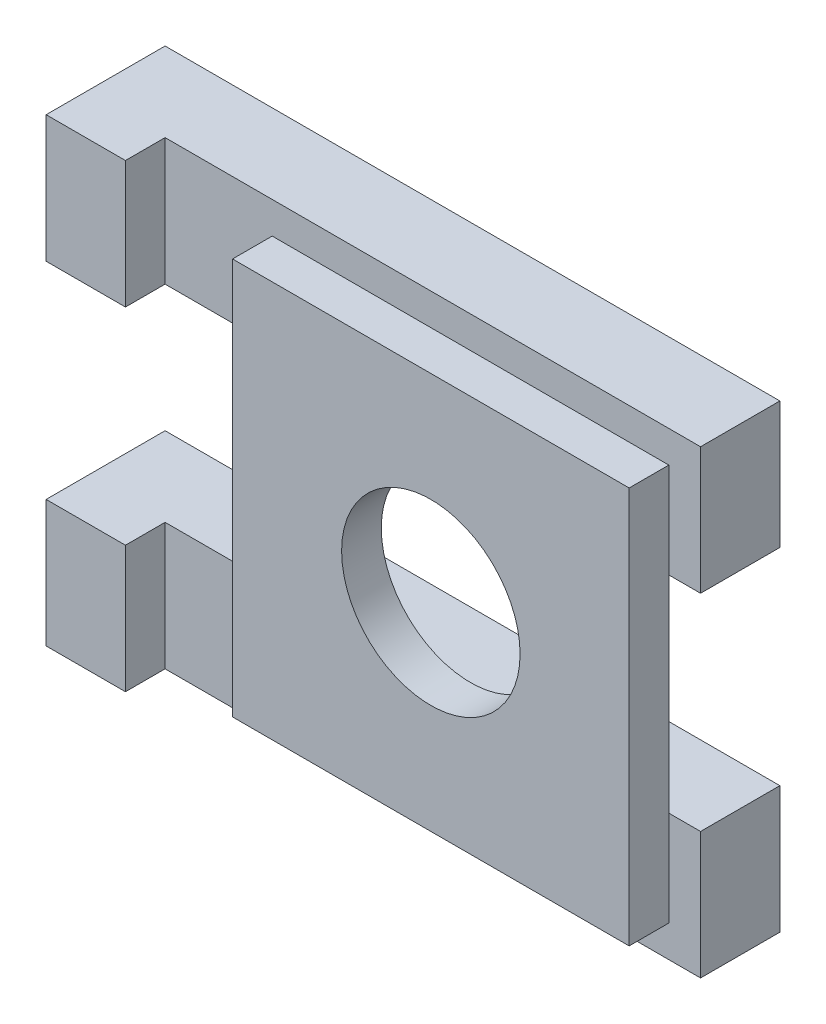
ISO-10303-21;
HEADER;
FILE_DESCRIPTION(('STEP AP214'),'2;1');
FILE_NAME('part.step','',(''),(''),'','','');
FILE_SCHEMA(('AUTOMOTIVE_DESIGN { 1 0 10303 214 1 1 1 1 }'));
ENDSEC;
DATA;
#1=APPLICATION_CONTEXT('core data for automotive mechanical design processes');
#2=APPLICATION_PROTOCOL_DEFINITION('international standard','automotive_design',2000,#1);
#3=PRODUCT_CONTEXT('',#1,'mechanical');
#4=PRODUCT('Part','Part','',(#3));
#5=PRODUCT_RELATED_PRODUCT_CATEGORY('part','',(#4));
#6=PRODUCT_DEFINITION_FORMATION('','',#4);
#7=PRODUCT_DEFINITION_CONTEXT('part definition',#1,'design');
#8=PRODUCT_DEFINITION('design','',#6,#7);
#9=PRODUCT_DEFINITION_SHAPE('','',#8);
#10=(LENGTH_UNIT() NAMED_UNIT(*) SI_UNIT(.MILLI.,.METRE.));
#11=(NAMED_UNIT(*) PLANE_ANGLE_UNIT() SI_UNIT($,.RADIAN.));
#12=(NAMED_UNIT(*) SI_UNIT($,.STERADIAN.) SOLID_ANGLE_UNIT());
#13=UNCERTAINTY_MEASURE_WITH_UNIT(LENGTH_MEASURE(1.E-05),#10,'distance_accuracy_value','');
#14=(GEOMETRIC_REPRESENTATION_CONTEXT(3) GLOBAL_UNCERTAINTY_ASSIGNED_CONTEXT((#13)) GLOBAL_UNIT_ASSIGNED_CONTEXT((#10,
#11,#12)) REPRESENTATION_CONTEXT('',''));
#15=CARTESIAN_POINT('',(0.,0.,0.));
#16=DIRECTION('',(0.,0.,1.));
#17=DIRECTION('',(1.,0.,0.));
#18=AXIS2_PLACEMENT_3D('',#15,#16,#17);
#19=CARTESIAN_POINT('',(0.,0.,0.));
#20=DIRECTION('',(0.,0.,1.));
#21=DIRECTION('',(1.,0.,0.));
#22=AXIS2_PLACEMENT_3D('',#19,#20,#21);
#23=PLANE('',#22);
#24=DIRECTION('',(1.,0.,0.));
#25=VECTOR('',#24,1.);
#26=CARTESIAN_POINT('',(58.,-26.,0.));
#27=LINE('',#26,#25);
#28=CARTESIAN_POINT('',(-77.,-26.,0.));
#29=VERTEX_POINT('',#28);
#30=CARTESIAN_POINT('',(-50.,-26.,0.));
#31=VERTEX_POINT('',#30);
#32=EDGE_CURVE('E190',#29,#31,#27,.T.);
#33=ORIENTED_EDGE('',*,*,#32,.F.);
#34=DIRECTION('',(0.,1.,0.));
#35=VECTOR('',#34,1.);
#36=CARTESIAN_POINT('',(-77.,-26.,0.));
#37=LINE('',#36,#35);
#38=CARTESIAN_POINT('',(-77.,-58.,0.));
#39=VERTEX_POINT('',#38);
#40=EDGE_CURVE('E177',#39,#29,#37,.T.);
#41=ORIENTED_EDGE('',*,*,#40,.F.);
#42=DIRECTION('',(-1.,0.,0.));
#43=VECTOR('',#42,1.);
#44=CARTESIAN_POINT('',(58.,-58.,0.));
#45=LINE('',#44,#43);
#46=CARTESIAN_POINT('',(58.,-58.,0.));
#47=VERTEX_POINT('',#46);
#48=EDGE_CURVE('E187',#47,#39,#45,.T.);
#49=ORIENTED_EDGE('',*,*,#48,.F.);
#50=DIRECTION('',(0.,-1.,0.));
#51=VECTOR('',#50,1.);
#52=CARTESIAN_POINT('',(58.,-58.,0.));
#53=LINE('',#52,#51);
#54=CARTESIAN_POINT('',(58.,-26.,0.));
#55=VERTEX_POINT('',#54);
#56=EDGE_CURVE('E200',#55,#47,#53,.T.);
#57=ORIENTED_EDGE('',*,*,#56,.F.);
#58=CARTESIAN_POINT('',(50.,-26.,0.));
#59=VERTEX_POINT('',#58);
#60=EDGE_CURVE('E208',#59,#55,#27,.T.);
#61=ORIENTED_EDGE('',*,*,#60,.F.);
#62=DIRECTION('',(0.,1.,0.));
#63=VECTOR('',#62,1.);
#64=CARTESIAN_POINT('',(50.,50.,0.));
#65=LINE('',#64,#63);
#66=CARTESIAN_POINT('',(50.,-50.,0.));
#67=VERTEX_POINT('',#66);
#68=EDGE_CURVE('E288',#67,#59,#65,.T.);
#69=ORIENTED_EDGE('',*,*,#68,.F.);
#70=DIRECTION('',(1.,0.,0.));
#71=VECTOR('',#70,1.);
#72=CARTESIAN_POINT('',(-50.,-50.,0.));
#73=LINE('',#72,#71);
#74=CARTESIAN_POINT('',(-50.,-50.,0.));
#75=VERTEX_POINT('',#74);
#76=EDGE_CURVE('E278',#75,#67,#73,.T.);
#77=ORIENTED_EDGE('',*,*,#76,.F.);
#78=DIRECTION('',(0.,-1.,0.));
#79=VECTOR('',#78,1.);
#80=CARTESIAN_POINT('',(-50.,50.,0.));
#81=LINE('',#80,#79);
#82=EDGE_CURVE('E204',#31,#75,#81,.T.);
#83=ORIENTED_EDGE('',*,*,#82,.F.);
#84=EDGE_LOOP('',(#33,#41,#49,#57,#61,#69,#77,#83));
#85=FACE_BOUND('',#84,.T.);
#86=ADVANCED_FACE('F43',(#85),#23,.T.);
#87=CARTESIAN_POINT('',(0.,0.,0.));
#88=DIRECTION('',(0.,0.,-1.));
#89=DIRECTION('',(-1.,0.,0.));
#90=AXIS2_PLACEMENT_3D('',#87,#88,#89);
#91=PLANE('',#90);
#92=DIRECTION('',(0.,1.,0.));
#93=VECTOR('',#92,1.);
#94=CARTESIAN_POINT('',(-77.,58.,0.));
#95=LINE('',#94,#93);
#96=CARTESIAN_POINT('',(-77.,26.,0.));
#97=VERTEX_POINT('',#96);
#98=CARTESIAN_POINT('',(-77.,58.,0.));
#99=VERTEX_POINT('',#98);
#100=EDGE_CURVE('E192',#97,#99,#95,.T.);
#101=ORIENTED_EDGE('',*,*,#100,.F.);
#102=DIRECTION('',(-1.,0.,0.));
#103=VECTOR('',#102,1.);
#104=CARTESIAN_POINT('',(58.,26.,0.));
#105=LINE('',#104,#103);
#106=CARTESIAN_POINT('',(-50.,26.,0.));
#107=VERTEX_POINT('',#106);
#108=EDGE_CURVE('E55',#107,#97,#105,.T.);
#109=ORIENTED_EDGE('',*,*,#108,.F.);
#110=DIRECTION('',(0.,-1.,0.));
#111=VECTOR('',#110,1.);
#112=CARTESIAN_POINT('',(-50.,50.,0.));
#113=LINE('',#112,#111);
#114=CARTESIAN_POINT('',(-50.,50.,0.));
#115=VERTEX_POINT('',#114);
#116=EDGE_CURVE('E297',#115,#107,#113,.T.);
#117=ORIENTED_EDGE('',*,*,#116,.F.);
#118=DIRECTION('',(-1.,0.,0.));
#119=VECTOR('',#118,1.);
#120=CARTESIAN_POINT('',(-50.,50.,0.));
#121=LINE('',#120,#119);
#122=CARTESIAN_POINT('',(50.,50.,0.));
#123=VERTEX_POINT('',#122);
#124=EDGE_CURVE('E292',#123,#115,#121,.T.);
#125=ORIENTED_EDGE('',*,*,#124,.F.);
#126=CARTESIAN_POINT('',(50.,26.,0.));
#127=VERTEX_POINT('',#126);
#128=EDGE_CURVE('E269',#127,#123,#65,.T.);
#129=ORIENTED_EDGE('',*,*,#128,.F.);
#130=CARTESIAN_POINT('',(58.,26.,0.));
#131=VERTEX_POINT('',#130);
#132=EDGE_CURVE('E54',#131,#127,#105,.T.);
#133=ORIENTED_EDGE('',*,*,#132,.F.);
#134=DIRECTION('',(0.,-1.,0.));
#135=VECTOR('',#134,1.);
#136=CARTESIAN_POINT('',(58.,58.,0.));
#137=LINE('',#136,#135);
#138=CARTESIAN_POINT('',(58.,58.,0.));
#139=VERTEX_POINT('',#138);
#140=EDGE_CURVE('E228',#139,#131,#137,.T.);
#141=ORIENTED_EDGE('',*,*,#140,.F.);
#142=DIRECTION('',(1.,0.,0.));
#143=VECTOR('',#142,1.);
#144=CARTESIAN_POINT('',(58.,58.,0.));
#145=LINE('',#144,#143);
#146=EDGE_CURVE('E234',#99,#139,#145,.T.);
#147=ORIENTED_EDGE('',*,*,#146,.F.);
#148=EDGE_LOOP('',(#101,#109,#117,#125,#129,#133,#141,#147));
#149=FACE_BOUND('',#148,.T.);
#150=ADVANCED_FACE('F327',(#149),#91,.F.);
#151=CARTESIAN_POINT('',(0.,0.,0.));
#152=DIRECTION('',(0.,0.,1.));
#153=DIRECTION('',(1.,0.,0.));
#154=AXIS2_PLACEMENT_3D('',#151,#152,#153);
#155=PLANE('',#154);
#156=CARTESIAN_POINT('',(0.,0.,0.));
#157=DIRECTION('',(0.,0.,1.));
#158=DIRECTION('',(1.,0.,0.));
#159=AXIS2_PLACEMENT_3D('',#156,#157,#158);
#160=CIRCLE('',#159,22.5);
#161=CARTESIAN_POINT('',(22.5,0.,0.));
#162=VERTEX_POINT('',#161);
#163=EDGE_CURVE('E264',#162,#162,#160,.T.);
#164=ORIENTED_EDGE('',*,*,#163,.T.);
#165=EDGE_LOOP('',(#164));
#166=FACE_BOUND('',#165,.T.);
#167=EDGE_CURVE('E206',#31,#59,#27,.T.);
#168=ORIENTED_EDGE('',*,*,#167,.F.);
#169=EDGE_CURVE('E296',#107,#31,#113,.T.);
#170=ORIENTED_EDGE('',*,*,#169,.F.);
#171=EDGE_CURVE('E11',#127,#107,#105,.T.);
#172=ORIENTED_EDGE('',*,*,#171,.F.);
#173=EDGE_CURVE('E293',#59,#127,#65,.T.);
#174=ORIENTED_EDGE('',*,*,#173,.F.);
#175=EDGE_LOOP('',(#168,#170,#172,#174));
#176=FACE_BOUND('',#175,.T.);
#177=ADVANCED_FACE('F336',(#166,#176),#155,.F.);
#178=CARTESIAN_POINT('',(0.,0.,10.));
#179=DIRECTION('',(0.,0.,1.));
#180=DIRECTION('',(1.,0.,0.));
#181=AXIS2_PLACEMENT_3D('',#178,#179,#180);
#182=PLANE('',#181);
#183=DIRECTION('',(0.,1.,0.));
#184=VECTOR('',#183,1.);
#185=CARTESIAN_POINT('',(50.,50.,10.));
#186=LINE('',#185,#184);
#187=CARTESIAN_POINT('',(50.,-50.,10.));
#188=VERTEX_POINT('',#187);
#189=CARTESIAN_POINT('',(50.,50.,10.));
#190=VERTEX_POINT('',#189);
#191=EDGE_CURVE('E273',#188,#190,#186,.T.);
#192=ORIENTED_EDGE('',*,*,#191,.T.);
#193=DIRECTION('',(-1.,0.,0.));
#194=VECTOR('',#193,1.);
#195=CARTESIAN_POINT('',(-50.,50.,10.));
#196=LINE('',#195,#194);
#197=CARTESIAN_POINT('',(-50.,50.,10.));
#198=VERTEX_POINT('',#197);
#199=EDGE_CURVE('E277',#190,#198,#196,.T.);
#200=ORIENTED_EDGE('',*,*,#199,.T.);
#201=DIRECTION('',(0.,-1.,0.));
#202=VECTOR('',#201,1.);
#203=CARTESIAN_POINT('',(-50.,50.,10.));
#204=LINE('',#203,#202);
#205=CARTESIAN_POINT('',(-50.,-50.,10.));
#206=VERTEX_POINT('',#205);
#207=EDGE_CURVE('E281',#198,#206,#204,.T.);
#208=ORIENTED_EDGE('',*,*,#207,.T.);
#209=DIRECTION('',(1.,0.,0.));
#210=VECTOR('',#209,1.);
#211=CARTESIAN_POINT('',(-50.,-50.,10.));
#212=LINE('',#211,#210);
#213=EDGE_CURVE('E284',#206,#188,#212,.T.);
#214=ORIENTED_EDGE('',*,*,#213,.T.);
#215=EDGE_LOOP('',(#192,#200,#208,#214));
#216=FACE_BOUND('',#215,.T.);
#217=CARTESIAN_POINT('',(0.,0.,10.));
#218=DIRECTION('',(0.,0.,1.));
#219=DIRECTION('',(1.,0.,0.));
#220=AXIS2_PLACEMENT_3D('',#217,#218,#219);
#221=CIRCLE('',#220,22.5);
#222=CARTESIAN_POINT('',(22.5,0.,10.));
#223=VERTEX_POINT('',#222);
#224=EDGE_CURVE('E265',#223,#223,#221,.T.);
#225=ORIENTED_EDGE('',*,*,#224,.F.);
#226=EDGE_LOOP('',(#225));
#227=FACE_BOUND('',#226,.T.);
#228=ADVANCED_FACE('F413',(#216,#227),#182,.T.);
#229=CARTESIAN_POINT('',(50.,50.,10.));
#230=DIRECTION('',(-1.,0.,0.));
#231=DIRECTION('',(0.,0.,1.));
#232=AXIS2_PLACEMENT_3D('',#229,#230,#231);
#233=PLANE('',#232);
#234=ORIENTED_EDGE('',*,*,#68,.T.);
#235=ORIENTED_EDGE('',*,*,#173,.T.);
#236=ORIENTED_EDGE('',*,*,#128,.T.);
#237=DIRECTION('',(0.,0.,-1.));
#238=VECTOR('',#237,1.);
#239=CARTESIAN_POINT('',(50.,50.,10.));
#240=LINE('',#239,#238);
#241=EDGE_CURVE('E47',#190,#123,#240,.T.);
#242=ORIENTED_EDGE('',*,*,#241,.F.);
#243=ORIENTED_EDGE('',*,*,#191,.F.);
#244=DIRECTION('',(0.,0.,-1.));
#245=VECTOR('',#244,1.);
#246=CARTESIAN_POINT('',(50.,-50.,10.));
#247=LINE('',#246,#245);
#248=EDGE_CURVE('E287',#188,#67,#247,.T.);
#249=ORIENTED_EDGE('',*,*,#248,.T.);
#250=EDGE_LOOP('',(#234,#235,#236,#242,#243,#249));
#251=FACE_BOUND('',#250,.T.);
#252=ADVANCED_FACE('F45',(#251),#233,.F.);
#253=CARTESIAN_POINT('',(-50.,50.,10.));
#254=DIRECTION('',(0.,-1.,0.));
#255=DIRECTION('',(0.,0.,-1.));
#256=AXIS2_PLACEMENT_3D('',#253,#254,#255);
#257=PLANE('',#256);
#258=ORIENTED_EDGE('',*,*,#124,.T.);
#259=DIRECTION('',(0.,0.,-1.));
#260=VECTOR('',#259,1.);
#261=CARTESIAN_POINT('',(-50.,50.,10.));
#262=LINE('',#261,#260);
#263=EDGE_CURVE('E309',#198,#115,#262,.T.);
#264=ORIENTED_EDGE('',*,*,#263,.F.);
#265=ORIENTED_EDGE('',*,*,#199,.F.);
#266=ORIENTED_EDGE('',*,*,#241,.T.);
#267=EDGE_LOOP('',(#258,#264,#265,#266));
#268=FACE_BOUND('',#267,.T.);
#269=ADVANCED_FACE('F321',(#268),#257,.F.);
#270=CARTESIAN_POINT('',(-50.,50.,10.));
#271=DIRECTION('',(1.,0.,0.));
#272=DIRECTION('',(0.,0.,-1.));
#273=AXIS2_PLACEMENT_3D('',#270,#271,#272);
#274=PLANE('',#273);
#275=ORIENTED_EDGE('',*,*,#116,.T.);
#276=ORIENTED_EDGE('',*,*,#169,.T.);
#277=ORIENTED_EDGE('',*,*,#82,.T.);
#278=DIRECTION('',(0.,0.,-1.));
#279=VECTOR('',#278,1.);
#280=CARTESIAN_POINT('',(-50.,-50.,10.));
#281=LINE('',#280,#279);
#282=EDGE_CURVE('E306',#206,#75,#281,.T.);
#283=ORIENTED_EDGE('',*,*,#282,.F.);
#284=ORIENTED_EDGE('',*,*,#207,.F.);
#285=ORIENTED_EDGE('',*,*,#263,.T.);
#286=EDGE_LOOP('',(#275,#276,#277,#283,#284,#285));
#287=FACE_BOUND('',#286,.T.);
#288=ADVANCED_FACE('F332',(#287),#274,.F.);
#289=CARTESIAN_POINT('',(-50.,-50.,10.));
#290=DIRECTION('',(0.,1.,0.));
#291=DIRECTION('',(0.,0.,1.));
#292=AXIS2_PLACEMENT_3D('',#289,#290,#291);
#293=PLANE('',#292);
#294=ORIENTED_EDGE('',*,*,#76,.T.);
#295=ORIENTED_EDGE('',*,*,#248,.F.);
#296=ORIENTED_EDGE('',*,*,#213,.F.);
#297=ORIENTED_EDGE('',*,*,#282,.T.);
#298=EDGE_LOOP('',(#294,#295,#296,#297));
#299=FACE_BOUND('',#298,.T.);
#300=ADVANCED_FACE('F410',(#299),#293,.F.);
#301=CARTESIAN_POINT('',(0.,0.,10.));
#302=DIRECTION('',(0.,0.,-1.));
#303=DIRECTION('',(-1.,0.,0.));
#304=AXIS2_PLACEMENT_3D('',#301,#302,#303);
#305=CYLINDRICAL_SURFACE('',#304,22.5);
#306=ORIENTED_EDGE('',*,*,#224,.T.);
#307=EDGE_LOOP('',(#306));
#308=FACE_BOUND('',#307,.T.);
#309=ORIENTED_EDGE('',*,*,#163,.F.);
#310=EDGE_LOOP('',(#309));
#311=FACE_BOUND('',#310,.T.);
#312=ADVANCED_FACE('F419',(#308,#311),#305,.F.);
#313=CARTESIAN_POINT('',(58.,58.,-20.));
#314=DIRECTION('',(-1.,0.,0.));
#315=DIRECTION('',(0.,0.,1.));
#316=AXIS2_PLACEMENT_3D('',#313,#314,#315);
#317=PLANE('',#316);
#318=ORIENTED_EDGE('',*,*,#140,.T.);
#319=DIRECTION('',(0.,0.,1.));
#320=VECTOR('',#319,1.);
#321=CARTESIAN_POINT('',(58.,26.,-20.));
#322=LINE('',#321,#320);
#323=CARTESIAN_POINT('',(58.,26.,-20.));
#324=VERTEX_POINT('',#323);
#325=EDGE_CURVE('E260',#324,#131,#322,.T.);
#326=ORIENTED_EDGE('',*,*,#325,.F.);
#327=DIRECTION('',(0.,-1.,0.));
#328=VECTOR('',#327,1.);
#329=CARTESIAN_POINT('',(58.,58.,-20.));
#330=LINE('',#329,#328);
#331=CARTESIAN_POINT('',(58.,58.,-20.));
#332=VERTEX_POINT('',#331);
#333=EDGE_CURVE('E229',#332,#324,#330,.T.);
#334=ORIENTED_EDGE('',*,*,#333,.F.);
#335=DIRECTION('',(0.,0.,1.));
#336=VECTOR('',#335,1.);
#337=CARTESIAN_POINT('',(58.,58.,-20.));
#338=LINE('',#337,#336);
#339=EDGE_CURVE('E243',#332,#139,#338,.T.);
#340=ORIENTED_EDGE('',*,*,#339,.T.);
#341=EDGE_LOOP('',(#318,#326,#334,#340));
#342=FACE_BOUND('',#341,.T.);
#343=ADVANCED_FACE('F353',(#342),#317,.F.);
#344=CARTESIAN_POINT('',(58.,26.,-20.));
#345=DIRECTION('',(0.,1.,0.));
#346=DIRECTION('',(0.,0.,1.));
#347=AXIS2_PLACEMENT_3D('',#344,#345,#346);
#348=PLANE('',#347);
#349=ORIENTED_EDGE('',*,*,#132,.T.);
#350=ORIENTED_EDGE('',*,*,#171,.T.);
#351=ORIENTED_EDGE('',*,*,#108,.T.);
#352=DIRECTION('',(0.,0.,-1.));
#353=VECTOR('',#352,1.);
#354=CARTESIAN_POINT('',(-77.,26.,10.));
#355=LINE('',#354,#353);
#356=CARTESIAN_POINT('',(-77.,26.,10.));
#357=VERTEX_POINT('',#356);
#358=EDGE_CURVE('E347',#357,#97,#355,.T.);
#359=ORIENTED_EDGE('',*,*,#358,.F.);
#360=DIRECTION('',(1.,0.,0.));
#361=VECTOR('',#360,1.);
#362=CARTESIAN_POINT('',(-97.,26.,10.));
#363=LINE('',#362,#361);
#364=CARTESIAN_POINT('',(-97.,26.,10.));
#365=VERTEX_POINT('',#364);
#366=EDGE_CURVE('E371',#365,#357,#363,.T.);
#367=ORIENTED_EDGE('',*,*,#366,.F.);
#368=DIRECTION('',(0.,0.,1.));
#369=VECTOR('',#368,1.);
#370=CARTESIAN_POINT('',(-97.,26.,-20.));
#371=LINE('',#370,#369);
#372=CARTESIAN_POINT('',(-97.,26.,-20.));
#373=VERTEX_POINT('',#372);
#374=EDGE_CURVE('E257',#373,#365,#371,.T.);
#375=ORIENTED_EDGE('',*,*,#374,.F.);
#376=DIRECTION('',(-1.,0.,0.));
#377=VECTOR('',#376,1.);
#378=CARTESIAN_POINT('',(58.,26.,-20.));
#379=LINE('',#378,#377);
#380=EDGE_CURVE('E233',#324,#373,#379,.T.);
#381=ORIENTED_EDGE('',*,*,#380,.F.);
#382=ORIENTED_EDGE('',*,*,#325,.T.);
#383=EDGE_LOOP('',(#349,#350,#351,#359,#367,#375,#381,#382));
#384=FACE_BOUND('',#383,.T.);
#385=ADVANCED_FACE('F345',(#384),#348,.F.);
#386=CARTESIAN_POINT('',(-97.,58.,-20.));
#387=DIRECTION('',(1.,0.,0.));
#388=DIRECTION('',(0.,0.,-1.));
#389=AXIS2_PLACEMENT_3D('',#386,#387,#388);
#390=PLANE('',#389);
#391=ORIENTED_EDGE('',*,*,#374,.T.);
#392=DIRECTION('',(0.,-1.,0.));
#393=VECTOR('',#392,1.);
#394=CARTESIAN_POINT('',(-97.,58.,10.));
#395=LINE('',#394,#393);
#396=CARTESIAN_POINT('',(-97.,58.,10.));
#397=VERTEX_POINT('',#396);
#398=EDGE_CURVE('E368',#397,#365,#395,.T.);
#399=ORIENTED_EDGE('',*,*,#398,.F.);
#400=DIRECTION('',(0.,0.,1.));
#401=VECTOR('',#400,1.);
#402=CARTESIAN_POINT('',(-97.,58.,-20.));
#403=LINE('',#402,#401);
#404=CARTESIAN_POINT('',(-97.,58.,-20.));
#405=VERTEX_POINT('',#404);
#406=EDGE_CURVE('E254',#405,#397,#403,.T.);
#407=ORIENTED_EDGE('',*,*,#406,.F.);
#408=DIRECTION('',(0.,1.,0.));
#409=VECTOR('',#408,1.);
#410=CARTESIAN_POINT('',(-97.,58.,-20.));
#411=LINE('',#410,#409);
#412=EDGE_CURVE('E237',#373,#405,#411,.T.);
#413=ORIENTED_EDGE('',*,*,#412,.F.);
#414=EDGE_LOOP('',(#391,#399,#407,#413));
#415=FACE_BOUND('',#414,.T.);
#416=ADVANCED_FACE('F366',(#415),#390,.F.);
#417=CARTESIAN_POINT('',(58.,58.,-20.));
#418=DIRECTION('',(0.,-1.,0.));
#419=DIRECTION('',(0.,0.,-1.));
#420=AXIS2_PLACEMENT_3D('',#417,#418,#419);
#421=PLANE('',#420);
#422=ORIENTED_EDGE('',*,*,#406,.T.);
#423=DIRECTION('',(-1.,0.,0.));
#424=VECTOR('',#423,1.);
#425=CARTESIAN_POINT('',(-97.,58.,10.));
#426=LINE('',#425,#424);
#427=CARTESIAN_POINT('',(-77.,58.,10.));
#428=VERTEX_POINT('',#427);
#429=EDGE_CURVE('E383',#428,#397,#426,.T.);
#430=ORIENTED_EDGE('',*,*,#429,.F.);
#431=DIRECTION('',(0.,0.,-1.));
#432=VECTOR('',#431,1.);
#433=CARTESIAN_POINT('',(-77.,58.,10.));
#434=LINE('',#433,#432);
#435=EDGE_CURVE('E70',#428,#99,#434,.T.);
#436=ORIENTED_EDGE('',*,*,#435,.T.);
#437=ORIENTED_EDGE('',*,*,#146,.T.);
#438=ORIENTED_EDGE('',*,*,#339,.F.);
#439=DIRECTION('',(1.,0.,0.));
#440=VECTOR('',#439,1.);
#441=CARTESIAN_POINT('',(58.,58.,-20.));
#442=LINE('',#441,#440);
#443=EDGE_CURVE('E240',#405,#332,#442,.T.);
#444=ORIENTED_EDGE('',*,*,#443,.F.);
#445=EDGE_LOOP('',(#422,#430,#436,#437,#438,#444));
#446=FACE_BOUND('',#445,.T.);
#447=ADVANCED_FACE('F357',(#446),#421,.F.);
#448=CARTESIAN_POINT('',(0.,0.,-20.));
#449=DIRECTION('',(0.,0.,-1.));
#450=DIRECTION('',(-1.,0.,0.));
#451=AXIS2_PLACEMENT_3D('',#448,#449,#450);
#452=PLANE('',#451);
#453=ORIENTED_EDGE('',*,*,#333,.T.);
#454=ORIENTED_EDGE('',*,*,#380,.T.);
#455=ORIENTED_EDGE('',*,*,#412,.T.);
#456=ORIENTED_EDGE('',*,*,#443,.T.);
#457=EDGE_LOOP('',(#453,#454,#455,#456));
#458=FACE_BOUND('',#457,.T.);
#459=ADVANCED_FACE('F361',(#458),#452,.T.);
#460=CARTESIAN_POINT('',(58.,-58.,-20.));
#461=DIRECTION('',(-1.,0.,0.));
#462=DIRECTION('',(0.,0.,1.));
#463=AXIS2_PLACEMENT_3D('',#460,#461,#462);
#464=PLANE('',#463);
#465=ORIENTED_EDGE('',*,*,#56,.T.);
#466=DIRECTION('',(0.,0.,1.));
#467=VECTOR('',#466,1.);
#468=CARTESIAN_POINT('',(58.,-58.,-20.));
#469=LINE('',#468,#467);
#470=CARTESIAN_POINT('',(58.,-58.,-20.));
#471=VERTEX_POINT('',#470);
#472=EDGE_CURVE('E197',#471,#47,#469,.T.);
#473=ORIENTED_EDGE('',*,*,#472,.F.);
#474=DIRECTION('',(0.,-1.,0.));
#475=VECTOR('',#474,1.);
#476=CARTESIAN_POINT('',(58.,-58.,-20.));
#477=LINE('',#476,#475);
#478=CARTESIAN_POINT('',(58.,-26.,-20.));
#479=VERTEX_POINT('',#478);
#480=EDGE_CURVE('E221',#479,#471,#477,.T.);
#481=ORIENTED_EDGE('',*,*,#480,.F.);
#482=DIRECTION('',(0.,0.,1.));
#483=VECTOR('',#482,1.);
#484=CARTESIAN_POINT('',(58.,-26.,-20.));
#485=LINE('',#484,#483);
#486=EDGE_CURVE('E215',#479,#55,#485,.T.);
#487=ORIENTED_EDGE('',*,*,#486,.T.);
#488=EDGE_LOOP('',(#465,#473,#481,#487));
#489=FACE_BOUND('',#488,.T.);
#490=ADVANCED_FACE('F402',(#489),#464,.F.);
#491=CARTESIAN_POINT('',(58.,-58.,-20.));
#492=DIRECTION('',(0.,1.,0.));
#493=DIRECTION('',(0.,0.,1.));
#494=AXIS2_PLACEMENT_3D('',#491,#492,#493);
#495=PLANE('',#494);
#496=ORIENTED_EDGE('',*,*,#48,.T.);
#497=DIRECTION('',(0.,0.,-1.));
#498=VECTOR('',#497,1.);
#499=CARTESIAN_POINT('',(-77.,-58.,10.));
#500=LINE('',#499,#498);
#501=CARTESIAN_POINT('',(-77.,-58.,10.));
#502=VERTEX_POINT('',#501);
#503=EDGE_CURVE('E174',#502,#39,#500,.T.);
#504=ORIENTED_EDGE('',*,*,#503,.F.);
#505=DIRECTION('',(1.,0.,0.));
#506=VECTOR('',#505,1.);
#507=CARTESIAN_POINT('',(-97.,-58.,10.));
#508=LINE('',#507,#506);
#509=CARTESIAN_POINT('',(-97.,-58.,10.));
#510=VERTEX_POINT('',#509);
#511=EDGE_CURVE('E679',#510,#502,#508,.T.);
#512=ORIENTED_EDGE('',*,*,#511,.F.);
#513=DIRECTION('',(0.,0.,1.));
#514=VECTOR('',#513,1.);
#515=CARTESIAN_POINT('',(-97.,-58.,-20.));
#516=LINE('',#515,#514);
#517=CARTESIAN_POINT('',(-97.,-58.,-20.));
#518=VERTEX_POINT('',#517);
#519=EDGE_CURVE('E392',#518,#510,#516,.T.);
#520=ORIENTED_EDGE('',*,*,#519,.F.);
#521=DIRECTION('',(-1.,0.,0.));
#522=VECTOR('',#521,1.);
#523=CARTESIAN_POINT('',(58.,-58.,-20.));
#524=LINE('',#523,#522);
#525=EDGE_CURVE('E218',#471,#518,#524,.T.);
#526=ORIENTED_EDGE('',*,*,#525,.F.);
#527=ORIENTED_EDGE('',*,*,#472,.T.);
#528=EDGE_LOOP('',(#496,#504,#512,#520,#526,#527));
#529=FACE_BOUND('',#528,.T.);
#530=ADVANCED_FACE('F195',(#529),#495,.F.);
#531=CARTESIAN_POINT('',(-97.,-58.,-20.));
#532=DIRECTION('',(1.,0.,0.));
#533=DIRECTION('',(0.,0.,-1.));
#534=AXIS2_PLACEMENT_3D('',#531,#532,#533);
#535=PLANE('',#534);
#536=ORIENTED_EDGE('',*,*,#519,.T.);
#537=DIRECTION('',(0.,-1.,0.));
#538=VECTOR('',#537,1.);
#539=CARTESIAN_POINT('',(-97.,-26.,10.));
#540=LINE('',#539,#538);
#541=CARTESIAN_POINT('',(-97.,-26.,10.));
#542=VERTEX_POINT('',#541);
#543=EDGE_CURVE('E193',#542,#510,#540,.T.);
#544=ORIENTED_EDGE('',*,*,#543,.F.);
#545=DIRECTION('',(0.,0.,1.));
#546=VECTOR('',#545,1.);
#547=CARTESIAN_POINT('',(-97.,-26.,-20.));
#548=LINE('',#547,#546);
#549=CARTESIAN_POINT('',(-97.,-26.,-20.));
#550=VERTEX_POINT('',#549);
#551=EDGE_CURVE('E395',#550,#542,#548,.T.);
#552=ORIENTED_EDGE('',*,*,#551,.F.);
#553=DIRECTION('',(0.,1.,0.));
#554=VECTOR('',#553,1.);
#555=CARTESIAN_POINT('',(-97.,-58.,-20.));
#556=LINE('',#555,#554);
#557=EDGE_CURVE('E214',#518,#550,#556,.T.);
#558=ORIENTED_EDGE('',*,*,#557,.F.);
#559=EDGE_LOOP('',(#536,#544,#552,#558));
#560=FACE_BOUND('',#559,.T.);
#561=ADVANCED_FACE('F489',(#560),#535,.F.);
#562=CARTESIAN_POINT('',(58.,-26.,-20.));
#563=DIRECTION('',(0.,-1.,0.));
#564=DIRECTION('',(0.,0.,-1.));
#565=AXIS2_PLACEMENT_3D('',#562,#563,#564);
#566=PLANE('',#565);
#567=ORIENTED_EDGE('',*,*,#551,.T.);
#568=DIRECTION('',(-1.,0.,0.));
#569=VECTOR('',#568,1.);
#570=CARTESIAN_POINT('',(-97.,-26.,10.));
#571=LINE('',#570,#569);
#572=CARTESIAN_POINT('',(-77.,-26.,10.));
#573=VERTEX_POINT('',#572);
#574=EDGE_CURVE('E680',#573,#542,#571,.T.);
#575=ORIENTED_EDGE('',*,*,#574,.F.);
#576=DIRECTION('',(0.,0.,-1.));
#577=VECTOR('',#576,1.);
#578=CARTESIAN_POINT('',(-77.,-26.,10.));
#579=LINE('',#578,#577);
#580=EDGE_CURVE('E62',#573,#29,#579,.T.);
#581=ORIENTED_EDGE('',*,*,#580,.T.);
#582=ORIENTED_EDGE('',*,*,#32,.T.);
#583=ORIENTED_EDGE('',*,*,#167,.T.);
#584=ORIENTED_EDGE('',*,*,#60,.T.);
#585=ORIENTED_EDGE('',*,*,#486,.F.);
#586=DIRECTION('',(1.,0.,0.));
#587=VECTOR('',#586,1.);
#588=CARTESIAN_POINT('',(58.,-26.,-20.));
#589=LINE('',#588,#587);
#590=EDGE_CURVE('E211',#550,#479,#589,.T.);
#591=ORIENTED_EDGE('',*,*,#590,.F.);
#592=EDGE_LOOP('',(#567,#575,#581,#582,#583,#584,#585,#591));
#593=FACE_BOUND('',#592,.T.);
#594=ADVANCED_FACE('F405',(#593),#566,.F.);
#595=CARTESIAN_POINT('',(0.,0.,-20.));
#596=DIRECTION('',(0.,0.,1.));
#597=DIRECTION('',(1.,0.,0.));
#598=AXIS2_PLACEMENT_3D('',#595,#596,#597);
#599=PLANE('',#598);
#600=ORIENTED_EDGE('',*,*,#480,.T.);
#601=ORIENTED_EDGE('',*,*,#525,.T.);
#602=ORIENTED_EDGE('',*,*,#557,.T.);
#603=ORIENTED_EDGE('',*,*,#590,.T.);
#604=EDGE_LOOP('',(#600,#601,#602,#603));
#605=FACE_BOUND('',#604,.T.);
#606=ADVANCED_FACE('F439',(#605),#599,.F.);
#607=CARTESIAN_POINT('',(-77.,58.,10.));
#608=DIRECTION('',(-1.,0.,0.));
#609=DIRECTION('',(0.,0.,1.));
#610=AXIS2_PLACEMENT_3D('',#607,#608,#609);
#611=PLANE('',#610);
#612=ORIENTED_EDGE('',*,*,#100,.T.);
#613=ORIENTED_EDGE('',*,*,#435,.F.);
#614=DIRECTION('',(0.,1.,0.));
#615=VECTOR('',#614,1.);
#616=CARTESIAN_POINT('',(-77.,58.,10.));
#617=LINE('',#616,#615);
#618=EDGE_CURVE('E375',#357,#428,#617,.T.);
#619=ORIENTED_EDGE('',*,*,#618,.F.);
#620=ORIENTED_EDGE('',*,*,#358,.T.);
#621=EDGE_LOOP('',(#612,#613,#619,#620));
#622=FACE_BOUND('',#621,.T.);
#623=ADVANCED_FACE('F442',(#622),#611,.F.);
#624=CARTESIAN_POINT('',(0.,0.,10.));
#625=DIRECTION('',(0.,0.,1.));
#626=DIRECTION('',(1.,0.,0.));
#627=AXIS2_PLACEMENT_3D('',#624,#625,#626);
#628=PLANE('',#627);
#629=ORIENTED_EDGE('',*,*,#398,.T.);
#630=ORIENTED_EDGE('',*,*,#366,.T.);
#631=ORIENTED_EDGE('',*,*,#618,.T.);
#632=ORIENTED_EDGE('',*,*,#429,.T.);
#633=EDGE_LOOP('',(#629,#630,#631,#632));
#634=FACE_BOUND('',#633,.T.);
#635=ADVANCED_FACE('F510',(#634),#628,.T.);
#636=CARTESIAN_POINT('',(-77.,-26.,10.));
#637=DIRECTION('',(-1.,0.,0.));
#638=DIRECTION('',(0.,0.,1.));
#639=AXIS2_PLACEMENT_3D('',#636,#637,#638);
#640=PLANE('',#639);
#641=ORIENTED_EDGE('',*,*,#40,.T.);
#642=ORIENTED_EDGE('',*,*,#580,.F.);
#643=DIRECTION('',(0.,1.,0.));
#644=VECTOR('',#643,1.);
#645=CARTESIAN_POINT('',(-77.,-26.,10.));
#646=LINE('',#645,#644);
#647=EDGE_CURVE('E179',#502,#573,#646,.T.);
#648=ORIENTED_EDGE('',*,*,#647,.F.);
#649=ORIENTED_EDGE('',*,*,#503,.T.);
#650=EDGE_LOOP('',(#641,#642,#648,#649));
#651=FACE_BOUND('',#650,.T.);
#652=ADVANCED_FACE('F176',(#651),#640,.F.);
#653=CARTESIAN_POINT('',(0.,0.,10.));
#654=DIRECTION('',(0.,0.,1.));
#655=DIRECTION('',(1.,0.,0.));
#656=AXIS2_PLACEMENT_3D('',#653,#654,#655);
#657=PLANE('',#656);
#658=ORIENTED_EDGE('',*,*,#543,.T.);
#659=ORIENTED_EDGE('',*,*,#511,.T.);
#660=ORIENTED_EDGE('',*,*,#647,.T.);
#661=ORIENTED_EDGE('',*,*,#574,.T.);
#662=EDGE_LOOP('',(#658,#659,#660,#661));
#663=FACE_BOUND('',#662,.T.);
#664=ADVANCED_FACE('F524',(#663),#657,.T.);
#665=CLOSED_SHELL('',(#86,#150,#177,#228,#252,#269,#288,#300,#312,#343,#385,#416,#447,#459,#490,
#530,#561,#594,#606,#623,#635,#652,#664));
#666=MANIFOLD_SOLID_BREP('B2',#665);
#667=ADVANCED_BREP_SHAPE_REPRESENTATION('',(#18,#666),#14);
#668=SHAPE_DEFINITION_REPRESENTATION(#9,#667);
ENDSEC;
END-ISO-10303-21;
